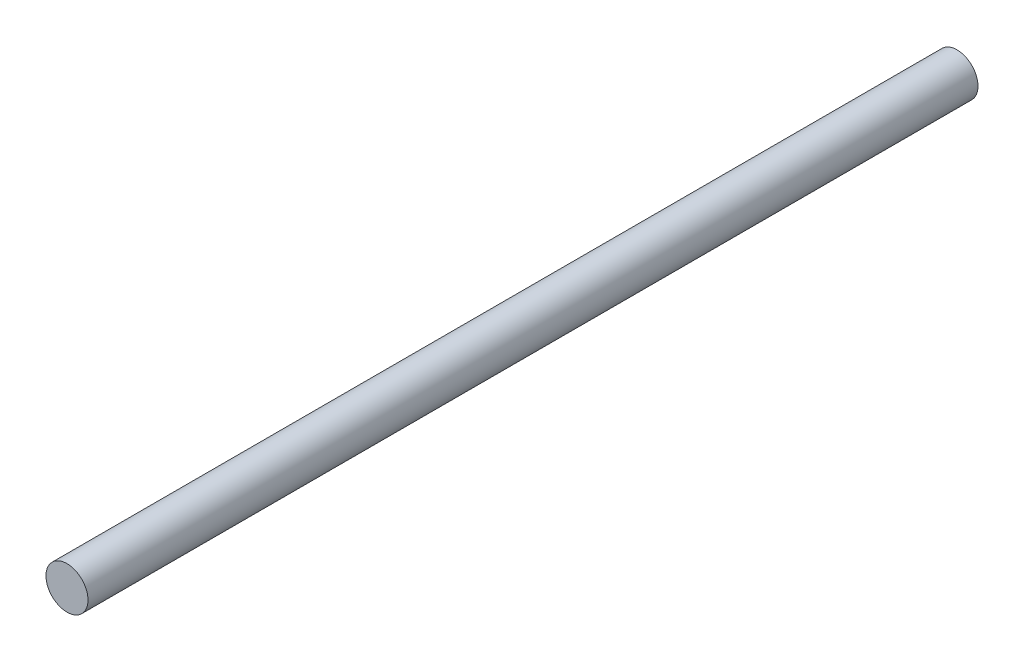
ISO-10303-21;
HEADER;
FILE_DESCRIPTION(('STEP AP214'),'2;1');
FILE_NAME('part.step','',(''),(''),'','','');
FILE_SCHEMA(('AUTOMOTIVE_DESIGN { 1 0 10303 214 1 1 1 1 }'));
ENDSEC;
DATA;
#1=APPLICATION_CONTEXT('core data for automotive mechanical design processes');
#2=APPLICATION_PROTOCOL_DEFINITION('international standard','automotive_design',2000,#1);
#3=PRODUCT_CONTEXT('',#1,'mechanical');
#4=PRODUCT('Part','Part','',(#3));
#5=PRODUCT_RELATED_PRODUCT_CATEGORY('part','',(#4));
#6=PRODUCT_DEFINITION_FORMATION('','',#4);
#7=PRODUCT_DEFINITION_CONTEXT('part definition',#1,'design');
#8=PRODUCT_DEFINITION('design','',#6,#7);
#9=PRODUCT_DEFINITION_SHAPE('','',#8);
#10=(LENGTH_UNIT() NAMED_UNIT(*) SI_UNIT(.MILLI.,.METRE.));
#11=(NAMED_UNIT(*) PLANE_ANGLE_UNIT() SI_UNIT($,.RADIAN.));
#12=(NAMED_UNIT(*) SI_UNIT($,.STERADIAN.) SOLID_ANGLE_UNIT());
#13=UNCERTAINTY_MEASURE_WITH_UNIT(LENGTH_MEASURE(1.E-05),#10,'distance_accuracy_value','');
#14=(GEOMETRIC_REPRESENTATION_CONTEXT(3) GLOBAL_UNCERTAINTY_ASSIGNED_CONTEXT((#13)) GLOBAL_UNIT_ASSIGNED_CONTEXT((#10,
#11,#12)) REPRESENTATION_CONTEXT('',''));
#15=CARTESIAN_POINT('',(0.,0.,0.));
#16=DIRECTION('',(0.,0.,1.));
#17=DIRECTION('',(1.,0.,0.));
#18=AXIS2_PLACEMENT_3D('',#15,#16,#17);
#19=CARTESIAN_POINT('',(0.,0.,127.));
#20=DIRECTION('',(0.,0.,-1.));
#21=DIRECTION('',(-1.,0.,0.));
#22=AXIS2_PLACEMENT_3D('',#19,#20,#21);
#23=CYLINDRICAL_SURFACE('',#22,3.);
#24=CARTESIAN_POINT('',(0.,0.,127.));
#25=DIRECTION('',(0.,0.,1.));
#26=DIRECTION('',(1.,0.,0.));
#27=AXIS2_PLACEMENT_3D('',#24,#25,#26);
#28=CIRCLE('',#27,3.);
#29=CARTESIAN_POINT('',(3.,0.,127.));
#30=VERTEX_POINT('',#29);
#31=EDGE_CURVE('E10',#30,#30,#28,.T.);
#32=ORIENTED_EDGE('',*,*,#31,.F.);
#33=EDGE_LOOP('',(#32));
#34=FACE_BOUND('',#33,.T.);
#35=CARTESIAN_POINT('',(0.,0.,0.));
#36=DIRECTION('',(0.,0.,1.));
#37=DIRECTION('',(1.,0.,0.));
#38=AXIS2_PLACEMENT_3D('',#35,#36,#37);
#39=CIRCLE('',#38,3.);
#40=CARTESIAN_POINT('',(3.,0.,0.));
#41=VERTEX_POINT('',#40);
#42=EDGE_CURVE('E36',#41,#41,#39,.T.);
#43=ORIENTED_EDGE('',*,*,#42,.T.);
#44=EDGE_LOOP('',(#43));
#45=FACE_BOUND('',#44,.T.);
#46=ADVANCED_FACE('F33',(#34,#45),#23,.T.);
#47=CARTESIAN_POINT('',(0.,0.,127.));
#48=DIRECTION('',(0.,0.,1.));
#49=DIRECTION('',(1.,0.,0.));
#50=AXIS2_PLACEMENT_3D('',#47,#48,#49);
#51=PLANE('',#50);
#52=ORIENTED_EDGE('',*,*,#31,.T.);
#53=EDGE_LOOP('',(#52));
#54=FACE_BOUND('',#53,.T.);
#55=ADVANCED_FACE('F48',(#54),#51,.T.);
#56=CARTESIAN_POINT('',(0.,0.,0.));
#57=DIRECTION('',(0.,0.,1.));
#58=DIRECTION('',(1.,0.,0.));
#59=AXIS2_PLACEMENT_3D('',#56,#57,#58);
#60=PLANE('',#59);
#61=ORIENTED_EDGE('',*,*,#42,.F.);
#62=EDGE_LOOP('',(#61));
#63=FACE_BOUND('',#62,.T.);
#64=ADVANCED_FACE('F46',(#63),#60,.F.);
#65=CLOSED_SHELL('',(#46,#55,#64));
#66=MANIFOLD_SOLID_BREP('B2',#65);
#67=ADVANCED_BREP_SHAPE_REPRESENTATION('',(#18,#66),#14);
#68=SHAPE_DEFINITION_REPRESENTATION(#9,#67);
ENDSEC;
END-ISO-10303-21;
